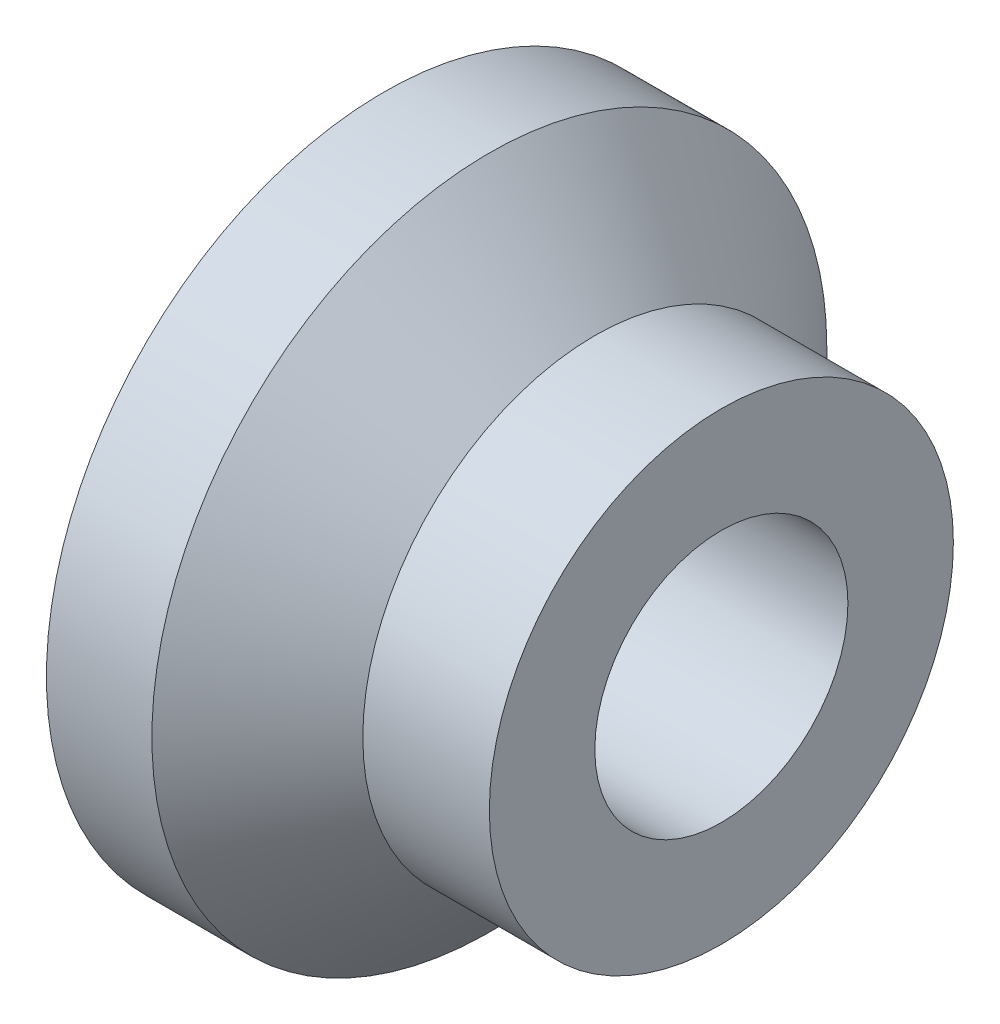
ISO-10303-21;
HEADER;
FILE_DESCRIPTION(('STEP AP214'),'2;1');
FILE_NAME('part.step','',(''),(''),'','','');
FILE_SCHEMA(('AUTOMOTIVE_DESIGN { 1 0 10303 214 1 1 1 1 }'));
ENDSEC;
DATA;
#1=APPLICATION_CONTEXT('core data for automotive mechanical design processes');
#2=APPLICATION_PROTOCOL_DEFINITION('international standard','automotive_design',2000,#1);
#3=PRODUCT_CONTEXT('',#1,'mechanical');
#4=PRODUCT('Part','Part','',(#3));
#5=PRODUCT_RELATED_PRODUCT_CATEGORY('part','',(#4));
#6=PRODUCT_DEFINITION_FORMATION('','',#4);
#7=PRODUCT_DEFINITION_CONTEXT('part definition',#1,'design');
#8=PRODUCT_DEFINITION('design','',#6,#7);
#9=PRODUCT_DEFINITION_SHAPE('','',#8);
#10=(LENGTH_UNIT() NAMED_UNIT(*) SI_UNIT(.MILLI.,.METRE.));
#11=(NAMED_UNIT(*) PLANE_ANGLE_UNIT() SI_UNIT($,.RADIAN.));
#12=(NAMED_UNIT(*) SI_UNIT($,.STERADIAN.) SOLID_ANGLE_UNIT());
#13=UNCERTAINTY_MEASURE_WITH_UNIT(LENGTH_MEASURE(1.E-05),#10,'distance_accuracy_value','');
#14=(GEOMETRIC_REPRESENTATION_CONTEXT(3) GLOBAL_UNCERTAINTY_ASSIGNED_CONTEXT((#13)) GLOBAL_UNIT_ASSIGNED_CONTEXT((#10,
#11,#12)) REPRESENTATION_CONTEXT('',''));
#15=CARTESIAN_POINT('',(0.,0.,0.));
#16=DIRECTION('',(0.,0.,1.));
#17=DIRECTION('',(1.,0.,0.));
#18=AXIS2_PLACEMENT_3D('',#15,#16,#17);
#19=CARTESIAN_POINT('',(4.,0.,0.));
#20=DIRECTION('',(1.,0.,0.));
#21=DIRECTION('',(0.,0.,-1.));
#22=AXIS2_PLACEMENT_3D('',#19,#20,#21);
#23=PLANE('',#22);
#24=CARTESIAN_POINT('',(4.,0.,0.));
#25=DIRECTION('',(1.,0.,0.));
#26=DIRECTION('',(0.,0.,-1.));
#27=AXIS2_PLACEMENT_3D('',#24,#25,#26);
#28=CIRCLE('',#27,1.5);
#29=CARTESIAN_POINT('',(4.,0.,-1.5));
#30=VERTEX_POINT('',#29);
#31=EDGE_CURVE('E54',#30,#30,#28,.T.);
#32=ORIENTED_EDGE('',*,*,#31,.F.);
#33=EDGE_LOOP('',(#32));
#34=FACE_BOUND('',#33,.T.);
#35=CARTESIAN_POINT('',(4.,0.,0.));
#36=DIRECTION('',(1.,0.,0.));
#37=DIRECTION('',(0.,0.,-1.));
#38=AXIS2_PLACEMENT_3D('',#35,#36,#37);
#39=CIRCLE('',#38,2.75);
#40=CARTESIAN_POINT('',(4.,0.,-2.75));
#41=VERTEX_POINT('',#40);
#42=EDGE_CURVE('E67',#41,#41,#39,.T.);
#43=ORIENTED_EDGE('',*,*,#42,.T.);
#44=EDGE_LOOP('',(#43));
#45=FACE_BOUND('',#44,.T.);
#46=ADVANCED_FACE('F39',(#34,#45),#23,.T.);
#47=CARTESIAN_POINT('',(4.,0.,0.));
#48=DIRECTION('',(-1.,0.,0.));
#49=DIRECTION('',(0.,0.,1.));
#50=AXIS2_PLACEMENT_3D('',#47,#48,#49);
#51=CYLINDRICAL_SURFACE('',#50,4.);
#52=CARTESIAN_POINT('',(1.24999999999999,0.,0.));
#53=DIRECTION('',(1.,0.,0.));
#54=DIRECTION('',(0.,0.,-1.));
#55=AXIS2_PLACEMENT_3D('',#52,#53,#54);
#56=CIRCLE('',#55,4.);
#57=CARTESIAN_POINT('',(1.24999999999999,0.,-4.));
#58=VERTEX_POINT('',#57);
#59=EDGE_CURVE('E11',#58,#58,#56,.F.);
#60=ORIENTED_EDGE('',*,*,#59,.T.);
#61=EDGE_LOOP('',(#60));
#62=FACE_BOUND('',#61,.T.);
#63=CARTESIAN_POINT('',(0.,0.,0.));
#64=DIRECTION('',(1.,0.,0.));
#65=DIRECTION('',(0.,0.,-1.));
#66=AXIS2_PLACEMENT_3D('',#63,#64,#65);
#67=CIRCLE('',#66,4.);
#68=CARTESIAN_POINT('',(0.,0.,-4.));
#69=VERTEX_POINT('',#68);
#70=EDGE_CURVE('E48',#69,#69,#67,.T.);
#71=ORIENTED_EDGE('',*,*,#70,.T.);
#72=EDGE_LOOP('',(#71));
#73=FACE_BOUND('',#72,.T.);
#74=ADVANCED_FACE('F87',(#62,#73),#51,.T.);
#75=CARTESIAN_POINT('',(0.,0.,0.));
#76=DIRECTION('',(1.,0.,0.));
#77=DIRECTION('',(0.,0.,-1.));
#78=AXIS2_PLACEMENT_3D('',#75,#76,#77);
#79=PLANE('',#78);
#80=ORIENTED_EDGE('',*,*,#70,.F.);
#81=EDGE_LOOP('',(#80));
#82=FACE_BOUND('',#81,.T.);
#83=CARTESIAN_POINT('',(0.,0.,0.));
#84=DIRECTION('',(1.,0.,0.));
#85=DIRECTION('',(0.,0.,-1.));
#86=AXIS2_PLACEMENT_3D('',#83,#84,#85);
#87=CIRCLE('',#86,1.5);
#88=CARTESIAN_POINT('',(0.,0.,-1.5));
#89=VERTEX_POINT('',#88);
#90=EDGE_CURVE('E60',#89,#89,#87,.T.);
#91=ORIENTED_EDGE('',*,*,#90,.T.);
#92=EDGE_LOOP('',(#91));
#93=FACE_BOUND('',#92,.T.);
#94=ADVANCED_FACE('F93',(#82,#93),#79,.F.);
#95=CARTESIAN_POINT('',(4.,0.,0.));
#96=DIRECTION('',(-1.,0.,0.));
#97=DIRECTION('',(0.,0.,1.));
#98=AXIS2_PLACEMENT_3D('',#95,#96,#97);
#99=CYLINDRICAL_SURFACE('',#98,1.5);
#100=ORIENTED_EDGE('',*,*,#31,.T.);
#101=EDGE_LOOP('',(#100));
#102=FACE_BOUND('',#101,.T.);
#103=ORIENTED_EDGE('',*,*,#90,.F.);
#104=EDGE_LOOP('',(#103));
#105=FACE_BOUND('',#104,.T.);
#106=ADVANCED_FACE('F84',(#102,#105),#99,.F.);
#107=CARTESIAN_POINT('',(2.5,0.,0.));
#108=DIRECTION('',(1.,0.,0.));
#109=DIRECTION('',(0.,0.,-1.));
#110=AXIS2_PLACEMENT_3D('',#107,#108,#109);
#111=CYLINDRICAL_SURFACE('',#110,2.75);
#112=CARTESIAN_POINT('',(2.5,0.,0.));
#113=DIRECTION('',(1.,0.,0.));
#114=DIRECTION('',(0.,0.,-1.));
#115=AXIS2_PLACEMENT_3D('',#112,#113,#114);
#116=CIRCLE('',#115,2.75);
#117=CARTESIAN_POINT('',(2.5,0.,-2.75));
#118=VERTEX_POINT('',#117);
#119=EDGE_CURVE('E65',#118,#118,#116,.T.);
#120=ORIENTED_EDGE('',*,*,#119,.T.);
#121=EDGE_LOOP('',(#120));
#122=FACE_BOUND('',#121,.T.);
#123=ORIENTED_EDGE('',*,*,#42,.F.);
#124=EDGE_LOOP('',(#123));
#125=FACE_BOUND('',#124,.T.);
#126=ADVANCED_FACE('F76',(#122,#125),#111,.T.);
#127=CARTESIAN_POINT('',(2.5,0.,0.));
#128=DIRECTION('',(-1.,0.,0.));
#129=DIRECTION('',(0.,0.,1.));
#130=AXIS2_PLACEMENT_3D('',#127,#128,#129);
#131=CONICAL_SURFACE('',#130,2.75,0.785398163397447);
#132=ORIENTED_EDGE('',*,*,#59,.F.);
#133=EDGE_LOOP('',(#132));
#134=FACE_BOUND('',#133,.T.);
#135=ORIENTED_EDGE('',*,*,#119,.F.);
#136=EDGE_LOOP('',(#135));
#137=FACE_BOUND('',#136,.T.);
#138=ADVANCED_FACE('F42',(#134,#137),#131,.T.);
#139=CLOSED_SHELL('',(#46,#74,#94,#106,#126,#138));
#140=MANIFOLD_SOLID_BREP('B2',#139);
#141=ADVANCED_BREP_SHAPE_REPRESENTATION('',(#18,#140),#14);
#142=SHAPE_DEFINITION_REPRESENTATION(#9,#141);
ENDSEC;
END-ISO-10303-21;
